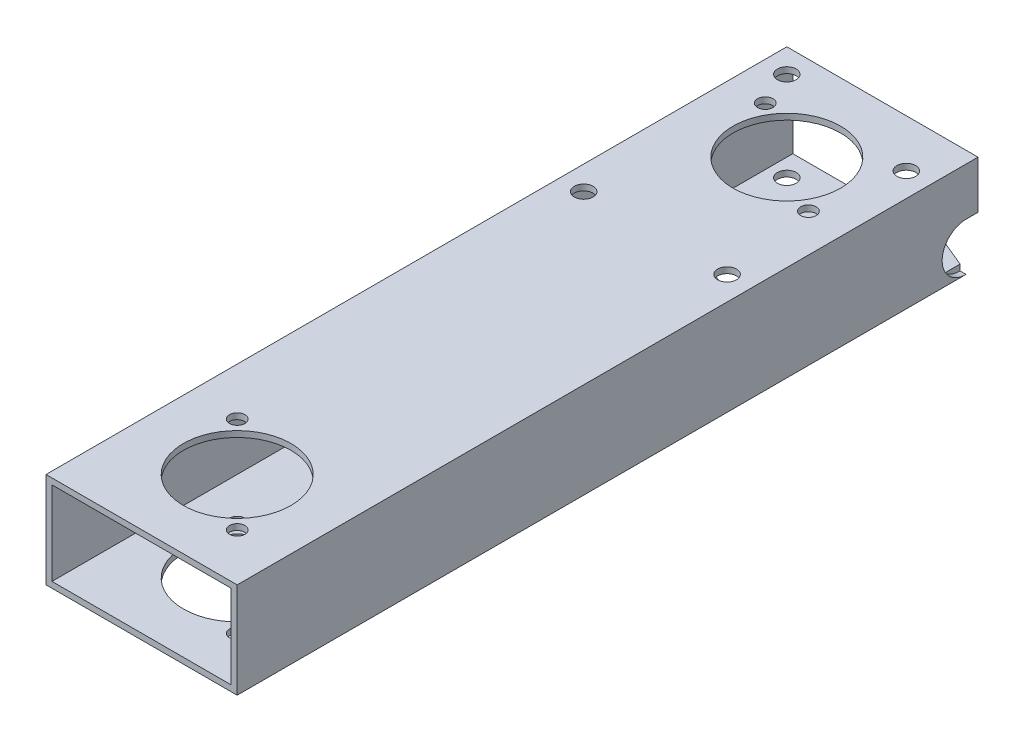
ISO-10303-21;
HEADER;
FILE_DESCRIPTION(('STEP AP214'),'2;1');
FILE_NAME('part.step','',(''),(''),'','','');
FILE_SCHEMA(('AUTOMOTIVE_DESIGN { 1 0 10303 214 1 1 1 1 }'));
ENDSEC;
DATA;
#1=APPLICATION_CONTEXT('core data for automotive mechanical design processes');
#2=APPLICATION_PROTOCOL_DEFINITION('international standard','automotive_design',2000,#1);
#3=PRODUCT_CONTEXT('',#1,'mechanical');
#4=PRODUCT('Part','Part','',(#3));
#5=PRODUCT_RELATED_PRODUCT_CATEGORY('part','',(#4));
#6=PRODUCT_DEFINITION_FORMATION('','',#4);
#7=PRODUCT_DEFINITION_CONTEXT('part definition',#1,'design');
#8=PRODUCT_DEFINITION('design','',#6,#7);
#9=PRODUCT_DEFINITION_SHAPE('','',#8);
#10=(LENGTH_UNIT() NAMED_UNIT(*) SI_UNIT(.MILLI.,.METRE.));
#11=(NAMED_UNIT(*) PLANE_ANGLE_UNIT() SI_UNIT($,.RADIAN.));
#12=(NAMED_UNIT(*) SI_UNIT($,.STERADIAN.) SOLID_ANGLE_UNIT());
#13=UNCERTAINTY_MEASURE_WITH_UNIT(LENGTH_MEASURE(1.E-05),#10,'distance_accuracy_value','');
#14=(GEOMETRIC_REPRESENTATION_CONTEXT(3) GLOBAL_UNCERTAINTY_ASSIGNED_CONTEXT((#13)) GLOBAL_UNIT_ASSIGNED_CONTEXT((#10,
#11,#12)) REPRESENTATION_CONTEXT('',''));
#15=CARTESIAN_POINT('',(0.,0.,0.));
#16=DIRECTION('',(0.,0.,1.));
#17=DIRECTION('',(1.,0.,0.));
#18=AXIS2_PLACEMENT_3D('',#15,#16,#17);
#19=CARTESIAN_POINT('',(25.4,12.7,98.4249994920001));
#20=DIRECTION('',(0.,-1.,0.));
#21=DIRECTION('',(1.,0.,0.));
#22=AXIS2_PLACEMENT_3D('',#19,#20,#21);
#23=PLANE('',#22);
#24=CARTESIAN_POINT('',(12.7519636919177,12.7,85.7769636919184));
#25=DIRECTION('',(0.,1.,0.));
#26=DIRECTION('',(0.,0.,1.));
#27=AXIS2_PLACEMENT_3D('',#24,#25,#26);
#28=CIRCLE('',#27,2.04469999999999);
#29=CARTESIAN_POINT('',(12.7519636919177,12.7,87.8216636919183));
#30=VERTEX_POINT('',#29);
#31=EDGE_CURVE('E449',#30,#30,#28,.T.);
#32=ORIENTED_EDGE('',*,*,#31,.F.);
#33=EDGE_LOOP('',(#32));
#34=FACE_BOUND('',#33,.T.);
#35=CARTESIAN_POINT('',(-15.2936993636111,12.7,-82.5815640151407));
#36=DIRECTION('',(0.,-1.,0.));
#37=DIRECTION('',(0.,0.,-1.));
#38=AXIS2_PLACEMENT_3D('',#35,#36,#37);
#39=CIRCLE('',#38,2.0447);
#40=CARTESIAN_POINT('',(-15.2936993636111,12.7,-84.6262640151407));
#41=VERTEX_POINT('',#40);
#42=EDGE_CURVE('E344',#41,#41,#39,.T.);
#43=ORIENTED_EDGE('',*,*,#42,.T.);
#44=EDGE_LOOP('',(#43));
#45=FACE_BOUND('',#44,.T.);
#46=CARTESIAN_POINT('',(15.293699363611,12.7,-63.4684359848592));
#47=DIRECTION('',(0.,-1.,0.));
#48=DIRECTION('',(0.,0.,-1.));
#49=AXIS2_PLACEMENT_3D('',#46,#47,#48);
#50=CIRCLE('',#49,2.0447);
#51=CARTESIAN_POINT('',(15.293699363611,12.7,-65.5131359848592));
#52=VERTEX_POINT('',#51);
#53=EDGE_CURVE('E232',#52,#52,#50,.T.);
#54=ORIENTED_EDGE('',*,*,#53,.T.);
#55=EDGE_LOOP('',(#54));
#56=FACE_BOUND('',#55,.T.);
#57=CARTESIAN_POINT('',(19.0500000000008,12.7,-85.7249994917966));
#58=DIRECTION('',(0.,-1.,0.));
#59=DIRECTION('',(0.,0.,-1.));
#60=AXIS2_PLACEMENT_3D('',#57,#58,#59);
#61=CIRCLE('',#60,2.48919999999999);
#62=CARTESIAN_POINT('',(19.0500000000008,12.7,-88.2141994917966));
#63=VERTEX_POINT('',#62);
#64=EDGE_CURVE('E228',#63,#63,#61,.T.);
#65=ORIENTED_EDGE('',*,*,#64,.T.);
#66=EDGE_LOOP('',(#65));
#67=FACE_BOUND('',#66,.T.);
#68=CARTESIAN_POINT('',(-19.0500000000001,12.7,-92.0749994917965));
#69=DIRECTION('',(0.,-1.,0.));
#70=DIRECTION('',(0.,0.,-1.));
#71=AXIS2_PLACEMENT_3D('',#68,#69,#70);
#72=CIRCLE('',#71,2.48919999999999);
#73=CARTESIAN_POINT('',(-19.0500000000001,12.7,-94.5641994917965));
#74=VERTEX_POINT('',#73);
#75=EDGE_CURVE('E224',#74,#74,#72,.T.);
#76=ORIENTED_EDGE('',*,*,#75,.T.);
#77=EDGE_LOOP('',(#76));
#78=FACE_BOUND('',#77,.T.);
#79=CARTESIAN_POINT('',(-19.0500000000001,12.7,-38.0999994917965));
#80=DIRECTION('',(0.,-1.,0.));
#81=DIRECTION('',(0.,0.,-1.));
#82=AXIS2_PLACEMENT_3D('',#79,#80,#81);
#83=CIRCLE('',#82,2.48919999999999);
#84=CARTESIAN_POINT('',(-19.0500000000001,12.7,-40.5891994917965));
#85=VERTEX_POINT('',#84);
#86=EDGE_CURVE('E219',#85,#85,#83,.T.);
#87=ORIENTED_EDGE('',*,*,#86,.T.);
#88=EDGE_LOOP('',(#87));
#89=FACE_BOUND('',#88,.T.);
#90=CARTESIAN_POINT('',(19.0500000000007,12.7,-38.0999994917965));
#91=DIRECTION('',(0.,-1.,0.));
#92=DIRECTION('',(0.,0.,-1.));
#93=AXIS2_PLACEMENT_3D('',#90,#91,#92);
#94=CIRCLE('',#93,2.48919999999999);
#95=CARTESIAN_POINT('',(19.0500000000007,12.7,-40.5891994917965));
#96=VERTEX_POINT('',#95);
#97=EDGE_CURVE('E271',#96,#96,#94,.T.);
#98=ORIENTED_EDGE('',*,*,#97,.T.);
#99=EDGE_LOOP('',(#98));
#100=FACE_BOUND('',#99,.T.);
#101=CARTESIAN_POINT('',(0.,12.7,-73.025));
#102=DIRECTION('',(0.,-1.,0.));
#103=DIRECTION('',(1.,0.,0.));
#104=AXIS2_PLACEMENT_3D('',#101,#102,#103);
#105=CIRCLE('',#104,14.2875);
#106=CARTESIAN_POINT('',(14.2875,12.7,-73.025));
#107=VERTEX_POINT('',#106);
#108=EDGE_CURVE('E211',#107,#107,#105,.T.);
#109=ORIENTED_EDGE('',*,*,#108,.T.);
#110=EDGE_LOOP('',(#109));
#111=FACE_BOUND('',#110,.T.);
#112=CARTESIAN_POINT('',(0.,12.7,73.025));
#113=DIRECTION('',(0.,-1.,0.));
#114=DIRECTION('',(1.,0.,0.));
#115=AXIS2_PLACEMENT_3D('',#112,#113,#114);
#116=CIRCLE('',#115,14.2875);
#117=CARTESIAN_POINT('',(14.2875,12.7,73.025));
#118=VERTEX_POINT('',#117);
#119=EDGE_CURVE('E301',#118,#118,#116,.T.);
#120=ORIENTED_EDGE('',*,*,#119,.T.);
#121=EDGE_LOOP('',(#120));
#122=FACE_BOUND('',#121,.T.);
#123=DIRECTION('',(0.,0.,-1.));
#124=VECTOR('',#123,1.);
#125=CARTESIAN_POINT('',(25.4,12.7,98.4249994920001));
#126=LINE('',#125,#124);
#127=CARTESIAN_POINT('',(25.4,12.7,98.4249994920001));
#128=VERTEX_POINT('',#127);
#129=CARTESIAN_POINT('',(25.4,12.7,-98.4249994920001));
#130=VERTEX_POINT('',#129);
#131=EDGE_CURVE('E202',#128,#130,#126,.T.);
#132=ORIENTED_EDGE('',*,*,#131,.T.);
#133=DIRECTION('',(-1.,0.,0.));
#134=VECTOR('',#133,1.);
#135=CARTESIAN_POINT('',(25.4,12.7,-98.4249994920001));
#136=LINE('',#135,#134);
#137=CARTESIAN_POINT('',(-25.4,12.7,-98.4249994920001));
#138=VERTEX_POINT('',#137);
#139=EDGE_CURVE('E173',#130,#138,#136,.T.);
#140=ORIENTED_EDGE('',*,*,#139,.T.);
#141=DIRECTION('',(0.,0.,-1.));
#142=VECTOR('',#141,1.);
#143=CARTESIAN_POINT('',(-25.4,12.7,98.4249994920001));
#144=LINE('',#143,#142);
#145=CARTESIAN_POINT('',(-25.4,12.7,98.4249994920001));
#146=VERTEX_POINT('',#145);
#147=EDGE_CURVE('E200',#146,#138,#144,.T.);
#148=ORIENTED_EDGE('',*,*,#147,.F.);
#149=DIRECTION('',(-1.,0.,0.));
#150=VECTOR('',#149,1.);
#151=CARTESIAN_POINT('',(25.4,12.7,98.4249994920001));
#152=LINE('',#151,#150);
#153=EDGE_CURVE('E198',#128,#146,#152,.T.);
#154=ORIENTED_EDGE('',*,*,#153,.F.);
#155=EDGE_LOOP('',(#132,#140,#148,#154));
#156=FACE_BOUND('',#155,.T.);
#157=CARTESIAN_POINT('',(-12.7519636919187,12.7,60.273036308082));
#158=DIRECTION('',(0.,1.,0.));
#159=DIRECTION('',(0.,0.,1.));
#160=AXIS2_PLACEMENT_3D('',#157,#158,#159);
#161=CIRCLE('',#160,2.04469999999999);
#162=CARTESIAN_POINT('',(-12.7519636919187,12.7,62.3177363080819));
#163=VERTEX_POINT('',#162);
#164=EDGE_CURVE('E436',#163,#163,#161,.T.);
#165=ORIENTED_EDGE('',*,*,#164,.F.);
#166=EDGE_LOOP('',(#165));
#167=FACE_BOUND('',#166,.T.);
#168=ADVANCED_FACE('F42',(#34,#45,#56,#67,#78,#89,#100,#111,#122,#156,#167),#23,.F.);
#169=CARTESIAN_POINT('',(-25.4,-12.7,98.4249994920001));
#170=DIRECTION('',(0.,1.,0.));
#171=DIRECTION('',(-1.,0.,0.));
#172=AXIS2_PLACEMENT_3D('',#169,#170,#171);
#173=PLANE('',#172);
#174=CARTESIAN_POINT('',(-12.7519636919187,-12.7,60.273036308082));
#175=DIRECTION('',(0.,1.,0.));
#176=DIRECTION('',(0.,0.,1.));
#177=AXIS2_PLACEMENT_3D('',#174,#175,#176);
#178=CIRCLE('',#177,2.0447);
#179=CARTESIAN_POINT('',(-12.7519636919187,-12.7,62.317736308082));
#180=VERTEX_POINT('',#179);
#181=EDGE_CURVE('E438',#180,#180,#178,.T.);
#182=ORIENTED_EDGE('',*,*,#181,.T.);
#183=EDGE_LOOP('',(#182));
#184=FACE_BOUND('',#183,.T.);
#185=CARTESIAN_POINT('',(12.7519636919177,-12.7,85.7769636919184));
#186=DIRECTION('',(0.,1.,0.));
#187=DIRECTION('',(0.,0.,1.));
#188=AXIS2_PLACEMENT_3D('',#185,#186,#187);
#189=CIRCLE('',#188,2.0447);
#190=CARTESIAN_POINT('',(12.7519636919177,-12.7,87.8216636919183));
#191=VERTEX_POINT('',#190);
#192=EDGE_CURVE('E451',#191,#191,#189,.T.);
#193=ORIENTED_EDGE('',*,*,#192,.T.);
#194=EDGE_LOOP('',(#193));
#195=FACE_BOUND('',#194,.T.);
#196=CARTESIAN_POINT('',(15.293699363611,-12.7,-63.4684359848592));
#197=DIRECTION('',(0.,-1.,0.));
#198=DIRECTION('',(0.,0.,-1.));
#199=AXIS2_PLACEMENT_3D('',#196,#197,#198);
#200=CIRCLE('',#199,2.04469999999999);
#201=CARTESIAN_POINT('',(15.293699363611,-12.7,-65.5131359848592));
#202=VERTEX_POINT('',#201);
#203=EDGE_CURVE('E239',#202,#202,#200,.T.);
#204=ORIENTED_EDGE('',*,*,#203,.F.);
#205=EDGE_LOOP('',(#204));
#206=FACE_BOUND('',#205,.T.);
#207=CARTESIAN_POINT('',(19.0500000000008,-12.7,-85.7249994917966));
#208=DIRECTION('',(0.,-1.,0.));
#209=DIRECTION('',(0.,0.,-1.));
#210=AXIS2_PLACEMENT_3D('',#207,#208,#209);
#211=CIRCLE('',#210,2.48919999999999);
#212=CARTESIAN_POINT('',(19.0500000000008,-12.7,-88.2141994917966));
#213=VERTEX_POINT('',#212);
#214=EDGE_CURVE('E236',#213,#213,#211,.T.);
#215=ORIENTED_EDGE('',*,*,#214,.F.);
#216=EDGE_LOOP('',(#215));
#217=FACE_BOUND('',#216,.T.);
#218=CARTESIAN_POINT('',(-19.0500000000001,-12.7,-92.0749994917965));
#219=DIRECTION('',(0.,-1.,0.));
#220=DIRECTION('',(0.,0.,-1.));
#221=AXIS2_PLACEMENT_3D('',#218,#219,#220);
#222=CIRCLE('',#221,2.48919999999999);
#223=CARTESIAN_POINT('',(-19.0500000000001,-12.7,-94.5641994917965));
#224=VERTEX_POINT('',#223);
#225=EDGE_CURVE('E254',#224,#224,#222,.T.);
#226=ORIENTED_EDGE('',*,*,#225,.F.);
#227=EDGE_LOOP('',(#226));
#228=FACE_BOUND('',#227,.T.);
#229=CARTESIAN_POINT('',(-19.0500000000001,-12.7,-38.0999994917965));
#230=DIRECTION('',(0.,-1.,0.));
#231=DIRECTION('',(0.,0.,-1.));
#232=AXIS2_PLACEMENT_3D('',#229,#230,#231);
#233=CIRCLE('',#232,2.48919999999999);
#234=CARTESIAN_POINT('',(-19.0500000000001,-12.7,-40.5891994917965));
#235=VERTEX_POINT('',#234);
#236=EDGE_CURVE('E261',#235,#235,#233,.T.);
#237=ORIENTED_EDGE('',*,*,#236,.F.);
#238=EDGE_LOOP('',(#237));
#239=FACE_BOUND('',#238,.T.);
#240=CARTESIAN_POINT('',(19.0500000000007,-12.7,-38.0999994917965));
#241=DIRECTION('',(0.,-1.,0.));
#242=DIRECTION('',(0.,0.,-1.));
#243=AXIS2_PLACEMENT_3D('',#240,#241,#242);
#244=CIRCLE('',#243,2.48919999999999);
#245=CARTESIAN_POINT('',(19.0500000000007,-12.7,-40.5891994917965));
#246=VERTEX_POINT('',#245);
#247=EDGE_CURVE('E268',#246,#246,#244,.T.);
#248=ORIENTED_EDGE('',*,*,#247,.F.);
#249=EDGE_LOOP('',(#248));
#250=FACE_BOUND('',#249,.T.);
#251=CARTESIAN_POINT('',(0.,-12.7,-73.025));
#252=DIRECTION('',(0.,-1.,0.));
#253=DIRECTION('',(1.,0.,0.));
#254=AXIS2_PLACEMENT_3D('',#251,#252,#253);
#255=CIRCLE('',#254,14.2875);
#256=CARTESIAN_POINT('',(14.2875,-12.7,-73.025));
#257=VERTEX_POINT('',#256);
#258=EDGE_CURVE('E304',#257,#257,#255,.T.);
#259=ORIENTED_EDGE('',*,*,#258,.F.);
#260=EDGE_LOOP('',(#259));
#261=FACE_BOUND('',#260,.T.);
#262=CARTESIAN_POINT('',(0.,-12.7,73.025));
#263=DIRECTION('',(0.,-1.,0.));
#264=DIRECTION('',(1.,0.,0.));
#265=AXIS2_PLACEMENT_3D('',#262,#263,#264);
#266=CIRCLE('',#265,14.2875);
#267=CARTESIAN_POINT('',(14.2875,-12.7,73.025));
#268=VERTEX_POINT('',#267);
#269=EDGE_CURVE('E307',#268,#268,#266,.T.);
#270=ORIENTED_EDGE('',*,*,#269,.F.);
#271=EDGE_LOOP('',(#270));
#272=FACE_BOUND('',#271,.T.);
#273=DIRECTION('',(1.,0.,0.));
#274=VECTOR('',#273,1.);
#275=CARTESIAN_POINT('',(-25.4,-12.7,-98.4249994920001));
#276=LINE('',#275,#274);
#277=CARTESIAN_POINT('',(-25.4,-12.7,-98.4249994920001));
#278=VERTEX_POINT('',#277);
#279=CARTESIAN_POINT('',(16.1925,-12.7,-98.4249994920001));
#280=VERTEX_POINT('',#279);
#281=EDGE_CURVE('E169',#278,#280,#276,.T.);
#282=ORIENTED_EDGE('',*,*,#281,.T.);
#283=DIRECTION('',(-0.923076923076923,0.,-0.384615384615384));
#284=VECTOR('',#283,1.);
#285=CARTESIAN_POINT('',(23.8125,-12.7,-95.2499994920001));
#286=LINE('',#285,#284);
#287=CARTESIAN_POINT('',(23.8125,-12.7,-95.2499994920001));
#288=VERTEX_POINT('',#287);
#289=EDGE_CURVE('E134',#288,#280,#286,.T.);
#290=ORIENTED_EDGE('',*,*,#289,.F.);
#291=DIRECTION('',(1.,0.,0.));
#292=VECTOR('',#291,1.);
#293=CARTESIAN_POINT('',(23.8125,-12.7,-95.2499994920001));
#294=LINE('',#293,#292);
#295=CARTESIAN_POINT('',(25.4,-12.7,-95.2499994920001));
#296=VERTEX_POINT('',#295);
#297=EDGE_CURVE('E289',#288,#296,#294,.T.);
#298=ORIENTED_EDGE('',*,*,#297,.T.);
#299=DIRECTION('',(0.,0.,-1.));
#300=VECTOR('',#299,1.);
#301=CARTESIAN_POINT('',(25.4,-12.7,98.4249994920001));
#302=LINE('',#301,#300);
#303=CARTESIAN_POINT('',(25.4,-12.7,98.4249994920001));
#304=VERTEX_POINT('',#303);
#305=EDGE_CURVE('E51',#304,#296,#302,.T.);
#306=ORIENTED_EDGE('',*,*,#305,.F.);
#307=DIRECTION('',(1.,0.,0.));
#308=VECTOR('',#307,1.);
#309=CARTESIAN_POINT('',(-25.4,-12.7,98.4249994920001));
#310=LINE('',#309,#308);
#311=CARTESIAN_POINT('',(-25.4,-12.7,98.4249994920001));
#312=VERTEX_POINT('',#311);
#313=EDGE_CURVE('E194',#312,#304,#310,.T.);
#314=ORIENTED_EDGE('',*,*,#313,.F.);
#315=DIRECTION('',(0.,0.,-1.));
#316=VECTOR('',#315,1.);
#317=CARTESIAN_POINT('',(-25.4,-12.7,98.4249994920001));
#318=LINE('',#317,#316);
#319=EDGE_CURVE('E11',#312,#278,#318,.T.);
#320=ORIENTED_EDGE('',*,*,#319,.T.);
#321=EDGE_LOOP('',(#282,#290,#298,#306,#314,#320));
#322=FACE_BOUND('',#321,.T.);
#323=CARTESIAN_POINT('',(-15.2936993636111,-12.7,-82.5815640151407));
#324=DIRECTION('',(0.,-1.,0.));
#325=DIRECTION('',(0.,0.,-1.));
#326=AXIS2_PLACEMENT_3D('',#323,#324,#325);
#327=CIRCLE('',#326,2.04469999999999);
#328=CARTESIAN_POINT('',(-15.2936993636111,-12.7,-84.6262640151406));
#329=VERTEX_POINT('',#328);
#330=EDGE_CURVE('E342',#329,#329,#327,.T.);
#331=ORIENTED_EDGE('',*,*,#330,.F.);
#332=EDGE_LOOP('',(#331));
#333=FACE_BOUND('',#332,.T.);
#334=ADVANCED_FACE('F334',(#184,#195,#206,#217,#228,#239,#250,#261,#272,#322,#333),#173,.F.);
#335=CARTESIAN_POINT('',(0.,0.,98.4249994920001));
#336=DIRECTION('',(0.,0.,1.));
#337=DIRECTION('',(1.,0.,0.));
#338=AXIS2_PLACEMENT_3D('',#335,#336,#337);
#339=PLANE('',#338);
#340=DIRECTION('',(0.,-1.,0.));
#341=VECTOR('',#340,1.);
#342=CARTESIAN_POINT('',(-25.4,12.7,98.4249994920001));
#343=LINE('',#342,#341);
#344=EDGE_CURVE('E191',#146,#312,#343,.T.);
#345=ORIENTED_EDGE('',*,*,#344,.T.);
#346=ORIENTED_EDGE('',*,*,#313,.T.);
#347=DIRECTION('',(0.,1.,0.));
#348=VECTOR('',#347,1.);
#349=CARTESIAN_POINT('',(25.4,-12.7,98.4249994920001));
#350=LINE('',#349,#348);
#351=EDGE_CURVE('E196',#304,#128,#350,.T.);
#352=ORIENTED_EDGE('',*,*,#351,.T.);
#353=ORIENTED_EDGE('',*,*,#153,.T.);
#354=EDGE_LOOP('',(#345,#346,#352,#353));
#355=FACE_BOUND('',#354,.T.);
#356=DIRECTION('',(1.,0.,0.));
#357=VECTOR('',#356,1.);
#358=CARTESIAN_POINT('',(-23.8125,-11.1125,98.4249994920001));
#359=LINE('',#358,#357);
#360=CARTESIAN_POINT('',(-23.8125,-11.1125,98.4249994920001));
#361=VERTEX_POINT('',#360);
#362=CARTESIAN_POINT('',(23.8125,-11.1125,98.4249994920001));
#363=VERTEX_POINT('',#362);
#364=EDGE_CURVE('E178',#361,#363,#359,.T.);
#365=ORIENTED_EDGE('',*,*,#364,.F.);
#366=DIRECTION('',(0.,-1.,0.));
#367=VECTOR('',#366,1.);
#368=CARTESIAN_POINT('',(-23.8125,11.1125,98.4249994920001));
#369=LINE('',#368,#367);
#370=CARTESIAN_POINT('',(-23.8125,11.1125,98.4249994920001));
#371=VERTEX_POINT('',#370);
#372=EDGE_CURVE('E176',#371,#361,#369,.T.);
#373=ORIENTED_EDGE('',*,*,#372,.F.);
#374=DIRECTION('',(-1.,0.,0.));
#375=VECTOR('',#374,1.);
#376=CARTESIAN_POINT('',(23.8125,11.1125,98.4249994920001));
#377=LINE('',#376,#375);
#378=CARTESIAN_POINT('',(23.8125,11.1125,98.4249994920001));
#379=VERTEX_POINT('',#378);
#380=EDGE_CURVE('E182',#379,#371,#377,.T.);
#381=ORIENTED_EDGE('',*,*,#380,.F.);
#382=DIRECTION('',(0.,1.,0.));
#383=VECTOR('',#382,1.);
#384=CARTESIAN_POINT('',(23.8125,-11.1125,98.4249994920001));
#385=LINE('',#384,#383);
#386=EDGE_CURVE('E180',#363,#379,#385,.T.);
#387=ORIENTED_EDGE('',*,*,#386,.F.);
#388=EDGE_LOOP('',(#365,#373,#381,#387));
#389=FACE_BOUND('',#388,.T.);
#390=ADVANCED_FACE('F337',(#355,#389),#339,.T.);
#391=CARTESIAN_POINT('',(-25.4,12.7,98.4249994920001));
#392=DIRECTION('',(1.,0.,0.));
#393=DIRECTION('',(0.,0.,-1.));
#394=AXIS2_PLACEMENT_3D('',#391,#392,#393);
#395=PLANE('',#394);
#396=ORIENTED_EDGE('',*,*,#147,.T.);
#397=DIRECTION('',(0.,-1.,0.));
#398=VECTOR('',#397,1.);
#399=CARTESIAN_POINT('',(-25.4,12.7,-98.4249994920001));
#400=LINE('',#399,#398);
#401=EDGE_CURVE('E166',#138,#278,#400,.T.);
#402=ORIENTED_EDGE('',*,*,#401,.T.);
#403=ORIENTED_EDGE('',*,*,#319,.F.);
#404=ORIENTED_EDGE('',*,*,#344,.F.);
#405=EDGE_LOOP('',(#396,#402,#403,#404));
#406=FACE_BOUND('',#405,.T.);
#407=ADVANCED_FACE('F44',(#406),#395,.F.);
#408=CARTESIAN_POINT('',(25.4,-12.7,98.4249994920001));
#409=DIRECTION('',(-1.,0.,0.));
#410=DIRECTION('',(0.,0.,1.));
#411=AXIS2_PLACEMENT_3D('',#408,#409,#410);
#412=PLANE('',#411);
#413=ORIENTED_EDGE('',*,*,#305,.T.);
#414=CARTESIAN_POINT('',(25.4,-6.35,-95.2499994920001));
#415=DIRECTION('',(1.,0.,0.));
#416=DIRECTION('',(0.,0.,-1.));
#417=AXIS2_PLACEMENT_3D('',#414,#415,#416);
#418=CIRCLE('',#417,6.35);
#419=CARTESIAN_POINT('',(25.4,0.,-95.2499994920001));
#420=VERTEX_POINT('',#419);
#421=EDGE_CURVE('E139',#420,#296,#418,.T.);
#422=ORIENTED_EDGE('',*,*,#421,.F.);
#423=DIRECTION('',(0.,0.,1.));
#424=VECTOR('',#423,1.);
#425=CARTESIAN_POINT('',(25.4,0.,-95.2499994920001));
#426=LINE('',#425,#424);
#427=CARTESIAN_POINT('',(25.4,0.,-98.4249994920001));
#428=VERTEX_POINT('',#427);
#429=EDGE_CURVE('E291',#428,#420,#426,.T.);
#430=ORIENTED_EDGE('',*,*,#429,.F.);
#431=DIRECTION('',(0.,1.,0.));
#432=VECTOR('',#431,1.);
#433=CARTESIAN_POINT('',(25.4,-12.7,-98.4249994920001));
#434=LINE('',#433,#432);
#435=EDGE_CURVE('E171',#428,#130,#434,.T.);
#436=ORIENTED_EDGE('',*,*,#435,.T.);
#437=ORIENTED_EDGE('',*,*,#131,.F.);
#438=ORIENTED_EDGE('',*,*,#351,.F.);
#439=EDGE_LOOP('',(#413,#422,#430,#436,#437,#438));
#440=FACE_BOUND('',#439,.T.);
#441=ADVANCED_FACE('F396',(#440),#412,.F.);
#442=CARTESIAN_POINT('',(-23.8125,11.1125,98.4249994920001));
#443=DIRECTION('',(1.,0.,0.));
#444=DIRECTION('',(0.,1.,0.));
#445=AXIS2_PLACEMENT_3D('',#442,#443,#444);
#446=PLANE('',#445);
#447=DIRECTION('',(0.,0.,-1.));
#448=VECTOR('',#447,1.);
#449=CARTESIAN_POINT('',(-23.8125,-11.1125,98.4249994920001));
#450=LINE('',#449,#448);
#451=CARTESIAN_POINT('',(-23.8125,-11.1125,-98.4249994920001));
#452=VERTEX_POINT('',#451);
#453=EDGE_CURVE('E189',#361,#452,#450,.T.);
#454=ORIENTED_EDGE('',*,*,#453,.T.);
#455=DIRECTION('',(0.,-1.,0.));
#456=VECTOR('',#455,1.);
#457=CARTESIAN_POINT('',(-23.8125,11.1125,-98.4249994920001));
#458=LINE('',#457,#456);
#459=CARTESIAN_POINT('',(-23.8125,11.1125,-98.4249994920001));
#460=VERTEX_POINT('',#459);
#461=EDGE_CURVE('E156',#460,#452,#458,.T.);
#462=ORIENTED_EDGE('',*,*,#461,.F.);
#463=DIRECTION('',(0.,0.,-1.));
#464=VECTOR('',#463,1.);
#465=CARTESIAN_POINT('',(-23.8125,11.1125,98.4249994920001));
#466=LINE('',#465,#464);
#467=EDGE_CURVE('E184',#371,#460,#466,.T.);
#468=ORIENTED_EDGE('',*,*,#467,.F.);
#469=ORIENTED_EDGE('',*,*,#372,.T.);
#470=EDGE_LOOP('',(#454,#462,#468,#469));
#471=FACE_BOUND('',#470,.T.);
#472=ADVANCED_FACE('F321',(#471),#446,.T.);
#473=CARTESIAN_POINT('',(-23.8125,-11.1125,98.4249994920001));
#474=DIRECTION('',(0.,1.,0.));
#475=DIRECTION('',(0.,0.,1.));
#476=AXIS2_PLACEMENT_3D('',#473,#474,#475);
#477=PLANE('',#476);
#478=CARTESIAN_POINT('',(-12.7519636919187,-11.1125,60.273036308082));
#479=DIRECTION('',(0.,1.,0.));
#480=DIRECTION('',(0.,0.,1.));
#481=AXIS2_PLACEMENT_3D('',#478,#479,#480);
#482=CIRCLE('',#481,2.04469999999999);
#483=CARTESIAN_POINT('',(-12.7519636919187,-11.1125,62.3177363080819));
#484=VERTEX_POINT('',#483);
#485=EDGE_CURVE('E446',#484,#484,#482,.T.);
#486=ORIENTED_EDGE('',*,*,#485,.F.);
#487=EDGE_LOOP('',(#486));
#488=FACE_BOUND('',#487,.T.);
#489=CARTESIAN_POINT('',(12.7519636919177,-11.1125,85.7769636919184));
#490=DIRECTION('',(0.,1.,0.));
#491=DIRECTION('',(0.,0.,1.));
#492=AXIS2_PLACEMENT_3D('',#489,#490,#491);
#493=CIRCLE('',#492,2.04469999999999);
#494=CARTESIAN_POINT('',(12.7519636919177,-11.1125,87.8216636919183));
#495=VERTEX_POINT('',#494);
#496=EDGE_CURVE('E46',#495,#495,#493,.T.);
#497=ORIENTED_EDGE('',*,*,#496,.F.);
#498=EDGE_LOOP('',(#497));
#499=FACE_BOUND('',#498,.T.);
#500=CARTESIAN_POINT('',(-15.2936993636111,-11.1125,-82.5815640151407));
#501=DIRECTION('',(0.,1.,0.));
#502=DIRECTION('',(0.,0.,1.));
#503=AXIS2_PLACEMENT_3D('',#500,#501,#502);
#504=CIRCLE('',#503,2.04469999999999);
#505=CARTESIAN_POINT('',(-15.2936993636111,-11.1125,-80.5368640151407));
#506=VERTEX_POINT('',#505);
#507=EDGE_CURVE('E348',#506,#506,#504,.T.);
#508=ORIENTED_EDGE('',*,*,#507,.F.);
#509=EDGE_LOOP('',(#508));
#510=FACE_BOUND('',#509,.T.);
#511=CARTESIAN_POINT('',(15.293699363611,-11.1125,-63.4684359848592));
#512=DIRECTION('',(0.,1.,0.));
#513=DIRECTION('',(0.,0.,1.));
#514=AXIS2_PLACEMENT_3D('',#511,#512,#513);
#515=CIRCLE('',#514,2.04469999999999);
#516=CARTESIAN_POINT('',(15.293699363611,-11.1125,-61.4237359848592));
#517=VERTEX_POINT('',#516);
#518=EDGE_CURVE('E231',#517,#517,#515,.T.);
#519=ORIENTED_EDGE('',*,*,#518,.F.);
#520=EDGE_LOOP('',(#519));
#521=FACE_BOUND('',#520,.T.);
#522=CARTESIAN_POINT('',(19.0500000000008,-11.1125,-85.7249994917966));
#523=DIRECTION('',(0.,1.,0.));
#524=DIRECTION('',(0.,0.,1.));
#525=AXIS2_PLACEMENT_3D('',#522,#523,#524);
#526=CIRCLE('',#525,2.48919999999999);
#527=CARTESIAN_POINT('',(19.0500000000008,-11.1125,-83.2357994917966));
#528=VERTEX_POINT('',#527);
#529=EDGE_CURVE('E227',#528,#528,#526,.T.);
#530=ORIENTED_EDGE('',*,*,#529,.F.);
#531=EDGE_LOOP('',(#530));
#532=FACE_BOUND('',#531,.T.);
#533=CARTESIAN_POINT('',(-19.0500000000001,-11.1125,-92.0749994917965));
#534=DIRECTION('',(0.,1.,0.));
#535=DIRECTION('',(0.,0.,1.));
#536=AXIS2_PLACEMENT_3D('',#533,#534,#535);
#537=CIRCLE('',#536,2.48919999999999);
#538=CARTESIAN_POINT('',(-19.0500000000001,-11.1125,-89.5857994917965));
#539=VERTEX_POINT('',#538);
#540=EDGE_CURVE('E223',#539,#539,#537,.T.);
#541=ORIENTED_EDGE('',*,*,#540,.F.);
#542=EDGE_LOOP('',(#541));
#543=FACE_BOUND('',#542,.T.);
#544=CARTESIAN_POINT('',(-19.0500000000001,-11.1125,-38.0999994917965));
#545=DIRECTION('',(0.,1.,0.));
#546=DIRECTION('',(0.,0.,1.));
#547=AXIS2_PLACEMENT_3D('',#544,#545,#546);
#548=CIRCLE('',#547,2.48919999999999);
#549=CARTESIAN_POINT('',(-19.0500000000001,-11.1125,-35.6107994917966));
#550=VERTEX_POINT('',#549);
#551=EDGE_CURVE('E215',#550,#550,#548,.T.);
#552=ORIENTED_EDGE('',*,*,#551,.F.);
#553=EDGE_LOOP('',(#552));
#554=FACE_BOUND('',#553,.T.);
#555=CARTESIAN_POINT('',(19.0500000000007,-11.1125,-38.0999994917965));
#556=DIRECTION('',(0.,1.,0.));
#557=DIRECTION('',(0.,0.,1.));
#558=AXIS2_PLACEMENT_3D('',#555,#556,#557);
#559=CIRCLE('',#558,2.48919999999999);
#560=CARTESIAN_POINT('',(19.0500000000007,-11.1125,-35.6107994917965));
#561=VERTEX_POINT('',#560);
#562=EDGE_CURVE('E277',#561,#561,#559,.T.);
#563=ORIENTED_EDGE('',*,*,#562,.F.);
#564=EDGE_LOOP('',(#563));
#565=FACE_BOUND('',#564,.T.);
#566=DIRECTION('',(-0.923076923076923,0.,-0.384615384615384));
#567=VECTOR('',#566,1.);
#568=CARTESIAN_POINT('',(23.8125,-11.1125,-95.2499994920001));
#569=LINE('',#568,#567);
#570=CARTESIAN_POINT('',(23.8125,-11.1125,-95.2499994920001));
#571=VERTEX_POINT('',#570);
#572=CARTESIAN_POINT('',(16.1925,-11.1125,-98.4249994920001));
#573=VERTEX_POINT('',#572);
#574=EDGE_CURVE('E59',#571,#573,#569,.T.);
#575=ORIENTED_EDGE('',*,*,#574,.T.);
#576=DIRECTION('',(1.,0.,0.));
#577=VECTOR('',#576,1.);
#578=CARTESIAN_POINT('',(-23.8125,-11.1125,-98.4249994920001));
#579=LINE('',#578,#577);
#580=EDGE_CURVE('E148',#452,#573,#579,.T.);
#581=ORIENTED_EDGE('',*,*,#580,.F.);
#582=ORIENTED_EDGE('',*,*,#453,.F.);
#583=ORIENTED_EDGE('',*,*,#364,.T.);
#584=DIRECTION('',(0.,0.,-1.));
#585=VECTOR('',#584,1.);
#586=CARTESIAN_POINT('',(23.8125,-11.1125,98.4249994920001));
#587=LINE('',#586,#585);
#588=CARTESIAN_POINT('',(23.8125,-11.1125,-91.0498692856851));
#589=VERTEX_POINT('',#588);
#590=EDGE_CURVE('E187',#363,#589,#587,.T.);
#591=ORIENTED_EDGE('',*,*,#590,.T.);
#592=DIRECTION('',(0.,0.,-1.));
#593=VECTOR('',#592,1.);
#594=CARTESIAN_POINT('',(23.8125,-11.1125,98.4249994920001));
#595=LINE('',#594,#593);
#596=EDGE_CURVE('E151',#589,#571,#595,.T.);
#597=ORIENTED_EDGE('',*,*,#596,.T.);
#598=EDGE_LOOP('',(#575,#581,#582,#583,#591,#597));
#599=FACE_BOUND('',#598,.T.);
#600=CARTESIAN_POINT('',(0.,-11.1125,-73.025));
#601=DIRECTION('',(0.,1.,0.));
#602=DIRECTION('',(0.,0.,1.));
#603=AXIS2_PLACEMENT_3D('',#600,#601,#602);
#604=CIRCLE('',#603,14.2875);
#605=CARTESIAN_POINT('',(0.,-11.1125,-58.7375));
#606=VERTEX_POINT('',#605);
#607=EDGE_CURVE('E161',#606,#606,#604,.T.);
#608=ORIENTED_EDGE('',*,*,#607,.F.);
#609=EDGE_LOOP('',(#608));
#610=FACE_BOUND('',#609,.T.);
#611=CARTESIAN_POINT('',(0.,-11.1125,73.025));
#612=DIRECTION('',(0.,1.,0.));
#613=DIRECTION('',(0.,0.,1.));
#614=AXIS2_PLACEMENT_3D('',#611,#612,#613);
#615=CIRCLE('',#614,14.2875);
#616=CARTESIAN_POINT('',(0.,-11.1125,87.3125));
#617=VERTEX_POINT('',#616);
#618=EDGE_CURVE('E210',#617,#617,#615,.T.);
#619=ORIENTED_EDGE('',*,*,#618,.F.);
#620=EDGE_LOOP('',(#619));
#621=FACE_BOUND('',#620,.T.);
#622=ADVANCED_FACE('F145',(#488,#499,#510,#521,#532,#543,#554,#565,#599,#610,#621),#477,.T.);
#623=CARTESIAN_POINT('',(23.8125,-11.1125,98.4249994920001));
#624=DIRECTION('',(-1.,0.,0.));
#625=DIRECTION('',(0.,0.,1.));
#626=AXIS2_PLACEMENT_3D('',#623,#624,#625);
#627=PLANE('',#626);
#628=CARTESIAN_POINT('',(23.8125,-6.35,-95.2499994920001));
#629=DIRECTION('',(1.,0.,0.));
#630=DIRECTION('',(0.,0.,-1.));
#631=AXIS2_PLACEMENT_3D('',#628,#629,#630);
#632=CIRCLE('',#631,6.35);
#633=CARTESIAN_POINT('',(23.8125,0.,-95.2499994920001));
#634=VERTEX_POINT('',#633);
#635=EDGE_CURVE('E282',#634,#589,#632,.T.);
#636=ORIENTED_EDGE('',*,*,#635,.T.);
#637=ORIENTED_EDGE('',*,*,#590,.F.);
#638=ORIENTED_EDGE('',*,*,#386,.T.);
#639=DIRECTION('',(0.,0.,-1.));
#640=VECTOR('',#639,1.);
#641=CARTESIAN_POINT('',(23.8125,11.1125,98.4249994920001));
#642=LINE('',#641,#640);
#643=CARTESIAN_POINT('',(23.8125,11.1125,-98.4249994920001));
#644=VERTEX_POINT('',#643);
#645=EDGE_CURVE('E67',#379,#644,#642,.T.);
#646=ORIENTED_EDGE('',*,*,#645,.T.);
#647=DIRECTION('',(0.,1.,0.));
#648=VECTOR('',#647,1.);
#649=CARTESIAN_POINT('',(23.8125,-11.1125,-98.4249994920001));
#650=LINE('',#649,#648);
#651=CARTESIAN_POINT('',(23.8125,0.,-98.4249994920001));
#652=VERTEX_POINT('',#651);
#653=EDGE_CURVE('E157',#652,#644,#650,.T.);
#654=ORIENTED_EDGE('',*,*,#653,.F.);
#655=DIRECTION('',(0.,0.,1.));
#656=VECTOR('',#655,1.);
#657=CARTESIAN_POINT('',(23.8125,0.,-95.2499994920001));
#658=LINE('',#657,#656);
#659=EDGE_CURVE('E285',#652,#634,#658,.T.);
#660=ORIENTED_EDGE('',*,*,#659,.T.);
#661=EDGE_LOOP('',(#636,#637,#638,#646,#654,#660));
#662=FACE_BOUND('',#661,.T.);
#663=ADVANCED_FACE('F320',(#662),#627,.T.);
#664=CARTESIAN_POINT('',(23.8125,11.1125,98.4249994920001));
#665=DIRECTION('',(0.,-1.,0.));
#666=DIRECTION('',(0.,0.,-1.));
#667=AXIS2_PLACEMENT_3D('',#664,#665,#666);
#668=PLANE('',#667);
#669=CARTESIAN_POINT('',(-12.7519636919187,11.1125,60.273036308082));
#670=DIRECTION('',(0.,-1.,0.));
#671=DIRECTION('',(0.,0.,-1.));
#672=AXIS2_PLACEMENT_3D('',#669,#670,#671);
#673=CIRCLE('',#672,2.04469999999999);
#674=CARTESIAN_POINT('',(-12.7519636919187,11.1125,58.228336308082));
#675=VERTEX_POINT('',#674);
#676=EDGE_CURVE('E441',#675,#675,#673,.T.);
#677=ORIENTED_EDGE('',*,*,#676,.F.);
#678=EDGE_LOOP('',(#677));
#679=FACE_BOUND('',#678,.T.);
#680=CARTESIAN_POINT('',(12.7519636919177,11.1125,85.7769636919184));
#681=DIRECTION('',(0.,-1.,0.));
#682=DIRECTION('',(0.,0.,-1.));
#683=AXIS2_PLACEMENT_3D('',#680,#681,#682);
#684=CIRCLE('',#683,2.04469999999999);
#685=CARTESIAN_POINT('',(12.7519636919177,11.1125,83.7322636919184));
#686=VERTEX_POINT('',#685);
#687=EDGE_CURVE('E345',#686,#686,#684,.T.);
#688=ORIENTED_EDGE('',*,*,#687,.F.);
#689=EDGE_LOOP('',(#688));
#690=FACE_BOUND('',#689,.T.);
#691=CARTESIAN_POINT('',(-15.2936993636111,11.1125,-82.5815640151407));
#692=DIRECTION('',(0.,-1.,0.));
#693=DIRECTION('',(0.,0.,-1.));
#694=AXIS2_PLACEMENT_3D('',#691,#692,#693);
#695=CIRCLE('',#694,2.04469999999999);
#696=CARTESIAN_POINT('',(-15.2936993636111,11.1125,-84.6262640151407));
#697=VERTEX_POINT('',#696);
#698=EDGE_CURVE('E244',#697,#697,#695,.T.);
#699=ORIENTED_EDGE('',*,*,#698,.F.);
#700=EDGE_LOOP('',(#699));
#701=FACE_BOUND('',#700,.T.);
#702=CARTESIAN_POINT('',(15.293699363611,11.1125,-63.4684359848592));
#703=DIRECTION('',(0.,-1.,0.));
#704=DIRECTION('',(0.,0.,-1.));
#705=AXIS2_PLACEMENT_3D('',#702,#703,#704);
#706=CIRCLE('',#705,2.04469999999999);
#707=CARTESIAN_POINT('',(15.293699363611,11.1125,-65.5131359848592));
#708=VERTEX_POINT('',#707);
#709=EDGE_CURVE('E229',#708,#708,#706,.T.);
#710=ORIENTED_EDGE('',*,*,#709,.F.);
#711=EDGE_LOOP('',(#710));
#712=FACE_BOUND('',#711,.T.);
#713=CARTESIAN_POINT('',(19.0500000000008,11.1125,-85.7249994917966));
#714=DIRECTION('',(0.,-1.,0.));
#715=DIRECTION('',(0.,0.,-1.));
#716=AXIS2_PLACEMENT_3D('',#713,#714,#715);
#717=CIRCLE('',#716,2.48919999999999);
#718=CARTESIAN_POINT('',(19.0500000000008,11.1125,-88.2141994917966));
#719=VERTEX_POINT('',#718);
#720=EDGE_CURVE('E225',#719,#719,#717,.T.);
#721=ORIENTED_EDGE('',*,*,#720,.F.);
#722=EDGE_LOOP('',(#721));
#723=FACE_BOUND('',#722,.T.);
#724=CARTESIAN_POINT('',(-19.0500000000001,11.1125,-92.0749994917965));
#725=DIRECTION('',(0.,-1.,0.));
#726=DIRECTION('',(0.,0.,-1.));
#727=AXIS2_PLACEMENT_3D('',#724,#725,#726);
#728=CIRCLE('',#727,2.48919999999999);
#729=CARTESIAN_POINT('',(-19.0500000000001,11.1125,-94.5641994917965));
#730=VERTEX_POINT('',#729);
#731=EDGE_CURVE('E220',#730,#730,#728,.T.);
#732=ORIENTED_EDGE('',*,*,#731,.F.);
#733=EDGE_LOOP('',(#732));
#734=FACE_BOUND('',#733,.T.);
#735=CARTESIAN_POINT('',(-19.0500000000001,11.1125,-38.0999994917965));
#736=DIRECTION('',(0.,-1.,0.));
#737=DIRECTION('',(0.,0.,-1.));
#738=AXIS2_PLACEMENT_3D('',#735,#736,#737);
#739=CIRCLE('',#738,2.48919999999999);
#740=CARTESIAN_POINT('',(-19.0500000000001,11.1125,-40.5891994917965));
#741=VERTEX_POINT('',#740);
#742=EDGE_CURVE('E218',#741,#741,#739,.T.);
#743=ORIENTED_EDGE('',*,*,#742,.F.);
#744=EDGE_LOOP('',(#743));
#745=FACE_BOUND('',#744,.T.);
#746=CARTESIAN_POINT('',(19.0500000000007,11.1125,-38.0999994917965));
#747=DIRECTION('',(0.,-1.,0.));
#748=DIRECTION('',(0.,0.,-1.));
#749=AXIS2_PLACEMENT_3D('',#746,#747,#748);
#750=CIRCLE('',#749,2.48919999999999);
#751=CARTESIAN_POINT('',(19.0500000000007,11.1125,-40.5891994917965));
#752=VERTEX_POINT('',#751);
#753=EDGE_CURVE('E274',#752,#752,#750,.T.);
#754=ORIENTED_EDGE('',*,*,#753,.F.);
#755=EDGE_LOOP('',(#754));
#756=FACE_BOUND('',#755,.T.);
#757=CARTESIAN_POINT('',(0.,11.1125,-73.025));
#758=DIRECTION('',(0.,-1.,0.));
#759=DIRECTION('',(0.,0.,-1.));
#760=AXIS2_PLACEMENT_3D('',#757,#758,#759);
#761=CIRCLE('',#760,14.2875);
#762=CARTESIAN_POINT('',(0.,11.1125,-87.3125));
#763=VERTEX_POINT('',#762);
#764=EDGE_CURVE('E212',#763,#763,#761,.T.);
#765=ORIENTED_EDGE('',*,*,#764,.F.);
#766=EDGE_LOOP('',(#765));
#767=FACE_BOUND('',#766,.T.);
#768=CARTESIAN_POINT('',(0.,11.1125,73.025));
#769=DIRECTION('',(0.,-1.,0.));
#770=DIRECTION('',(0.,0.,-1.));
#771=AXIS2_PLACEMENT_3D('',#768,#769,#770);
#772=CIRCLE('',#771,14.2875);
#773=CARTESIAN_POINT('',(0.,11.1125,58.7375));
#774=VERTEX_POINT('',#773);
#775=EDGE_CURVE('E207',#774,#774,#772,.T.);
#776=ORIENTED_EDGE('',*,*,#775,.F.);
#777=EDGE_LOOP('',(#776));
#778=FACE_BOUND('',#777,.T.);
#779=ORIENTED_EDGE('',*,*,#467,.T.);
#780=DIRECTION('',(-1.,0.,0.));
#781=VECTOR('',#780,1.);
#782=CARTESIAN_POINT('',(23.8125,11.1125,-98.4249994920001));
#783=LINE('',#782,#781);
#784=EDGE_CURVE('E159',#644,#460,#783,.T.);
#785=ORIENTED_EDGE('',*,*,#784,.F.);
#786=ORIENTED_EDGE('',*,*,#645,.F.);
#787=ORIENTED_EDGE('',*,*,#380,.T.);
#788=EDGE_LOOP('',(#779,#785,#786,#787));
#789=FACE_BOUND('',#788,.T.);
#790=ADVANCED_FACE('F361',(#679,#690,#701,#712,#723,#734,#745,#756,#767,#778,#789),#668,.T.);
#791=CARTESIAN_POINT('',(0.,0.,-98.4249994920001));
#792=DIRECTION('',(0.,0.,1.));
#793=DIRECTION('',(1.,0.,0.));
#794=AXIS2_PLACEMENT_3D('',#791,#792,#793);
#795=PLANE('',#794);
#796=ORIENTED_EDGE('',*,*,#580,.T.);
#797=DIRECTION('',(0.,-1.,0.));
#798=VECTOR('',#797,1.);
#799=CARTESIAN_POINT('',(16.1925,-11.1125,-98.4249994920001));
#800=LINE('',#799,#798);
#801=EDGE_CURVE('E131',#573,#280,#800,.T.);
#802=ORIENTED_EDGE('',*,*,#801,.T.);
#803=ORIENTED_EDGE('',*,*,#281,.F.);
#804=ORIENTED_EDGE('',*,*,#401,.F.);
#805=ORIENTED_EDGE('',*,*,#139,.F.);
#806=ORIENTED_EDGE('',*,*,#435,.F.);
#807=DIRECTION('',(1.,0.,0.));
#808=VECTOR('',#807,1.);
#809=CARTESIAN_POINT('',(23.8125,0.,-98.4249994920001));
#810=LINE('',#809,#808);
#811=EDGE_CURVE('E296',#652,#428,#810,.T.);
#812=ORIENTED_EDGE('',*,*,#811,.F.);
#813=ORIENTED_EDGE('',*,*,#653,.T.);
#814=ORIENTED_EDGE('',*,*,#784,.T.);
#815=ORIENTED_EDGE('',*,*,#461,.T.);
#816=EDGE_LOOP('',(#796,#802,#803,#804,#805,#806,#812,#813,#814,#815));
#817=FACE_BOUND('',#816,.T.);
#818=ADVANCED_FACE('F153',(#817),#795,.F.);
#819=CARTESIAN_POINT('',(0.,12.7,73.025));
#820=DIRECTION('',(0.,-1.,0.));
#821=DIRECTION('',(1.,0.,0.));
#822=AXIS2_PLACEMENT_3D('',#819,#820,#821);
#823=CYLINDRICAL_SURFACE('',#822,14.2875);
#824=ORIENTED_EDGE('',*,*,#775,.T.);
#825=EDGE_LOOP('',(#824));
#826=FACE_BOUND('',#825,.T.);
#827=ORIENTED_EDGE('',*,*,#119,.F.);
#828=EDGE_LOOP('',(#827));
#829=FACE_BOUND('',#828,.T.);
#830=ADVANCED_FACE('F331',(#826,#829),#823,.F.);
#831=CARTESIAN_POINT('',(0.,12.7,-73.025));
#832=DIRECTION('',(0.,-1.,0.));
#833=DIRECTION('',(1.,0.,0.));
#834=AXIS2_PLACEMENT_3D('',#831,#832,#833);
#835=CYLINDRICAL_SURFACE('',#834,14.2875);
#836=ORIENTED_EDGE('',*,*,#764,.T.);
#837=EDGE_LOOP('',(#836));
#838=FACE_BOUND('',#837,.T.);
#839=ORIENTED_EDGE('',*,*,#108,.F.);
#840=EDGE_LOOP('',(#839));
#841=FACE_BOUND('',#840,.T.);
#842=ADVANCED_FACE('F329',(#838,#841),#835,.F.);
#843=ORIENTED_EDGE('',*,*,#618,.T.);
#844=EDGE_LOOP('',(#843));
#845=FACE_BOUND('',#844,.T.);
#846=ORIENTED_EDGE('',*,*,#269,.T.);
#847=EDGE_LOOP('',(#846));
#848=FACE_BOUND('',#847,.T.);
#849=ADVANCED_FACE('F326',(#845,#848),#823,.F.);
#850=ORIENTED_EDGE('',*,*,#607,.T.);
#851=EDGE_LOOP('',(#850));
#852=FACE_BOUND('',#851,.T.);
#853=ORIENTED_EDGE('',*,*,#258,.T.);
#854=EDGE_LOOP('',(#853));
#855=FACE_BOUND('',#854,.T.);
#856=ADVANCED_FACE('F316',(#852,#855),#835,.F.);
#857=CARTESIAN_POINT('',(23.8125,-6.35,-95.2499994920001));
#858=DIRECTION('',(1.,0.,0.));
#859=DIRECTION('',(0.,0.,-1.));
#860=AXIS2_PLACEMENT_3D('',#857,#858,#859);
#861=CYLINDRICAL_SURFACE('',#860,6.35);
#862=ORIENTED_EDGE('',*,*,#421,.T.);
#863=ORIENTED_EDGE('',*,*,#297,.F.);
#864=EDGE_CURVE('E286',#589,#288,#632,.T.);
#865=ORIENTED_EDGE('',*,*,#864,.F.);
#866=ORIENTED_EDGE('',*,*,#635,.F.);
#867=DIRECTION('',(1.,0.,0.));
#868=VECTOR('',#867,1.);
#869=CARTESIAN_POINT('',(23.8125,0.,-95.2499994920001));
#870=LINE('',#869,#868);
#871=EDGE_CURVE('E294',#634,#420,#870,.T.);
#872=ORIENTED_EDGE('',*,*,#871,.T.);
#873=EDGE_LOOP('',(#862,#863,#865,#866,#872));
#874=FACE_BOUND('',#873,.T.);
#875=ADVANCED_FACE('F422',(#874),#861,.F.);
#876=CARTESIAN_POINT('',(23.8125,0.,-95.2499994920001));
#877=DIRECTION('',(0.,1.,0.));
#878=DIRECTION('',(0.,0.,1.));
#879=AXIS2_PLACEMENT_3D('',#876,#877,#878);
#880=PLANE('',#879);
#881=ORIENTED_EDGE('',*,*,#429,.T.);
#882=ORIENTED_EDGE('',*,*,#871,.F.);
#883=ORIENTED_EDGE('',*,*,#659,.F.);
#884=ORIENTED_EDGE('',*,*,#811,.T.);
#885=EDGE_LOOP('',(#881,#882,#883,#884));
#886=FACE_BOUND('',#885,.T.);
#887=ADVANCED_FACE('F425',(#886),#880,.F.);
#888=CARTESIAN_POINT('',(23.8125,-6.35,-95.2499994920001));
#889=DIRECTION('',(1.,0.,0.));
#890=DIRECTION('',(0.,0.,-1.));
#891=AXIS2_PLACEMENT_3D('',#888,#889,#890);
#892=PLANE('',#891);
#893=DIRECTION('',(0.,-1.,0.));
#894=VECTOR('',#893,1.);
#895=CARTESIAN_POINT('',(23.8125,-11.1125,-95.2499994920001));
#896=LINE('',#895,#894);
#897=EDGE_CURVE('E140',#571,#288,#896,.T.);
#898=ORIENTED_EDGE('',*,*,#897,.F.);
#899=ORIENTED_EDGE('',*,*,#596,.F.);
#900=ORIENTED_EDGE('',*,*,#864,.T.);
#901=EDGE_LOOP('',(#898,#899,#900));
#902=FACE_BOUND('',#901,.T.);
#903=ADVANCED_FACE('F544',(#902),#892,.T.);
#904=CARTESIAN_POINT('',(23.8125,-11.1125,-95.2499994920001));
#905=DIRECTION('',(-0.384615384615384,0.,0.923076923076923));
#906=DIRECTION('',(0.923076923076923,0.,0.384615384615384));
#907=AXIS2_PLACEMENT_3D('',#904,#905,#906);
#908=PLANE('',#907);
#909=ORIENTED_EDGE('',*,*,#289,.T.);
#910=ORIENTED_EDGE('',*,*,#801,.F.);
#911=ORIENTED_EDGE('',*,*,#574,.F.);
#912=ORIENTED_EDGE('',*,*,#897,.T.);
#913=EDGE_LOOP('',(#909,#910,#911,#912));
#914=FACE_BOUND('',#913,.T.);
#915=ADVANCED_FACE('F132',(#914),#908,.F.);
#916=CARTESIAN_POINT('',(19.0500000000007,-12.7,-38.0999994917965));
#917=DIRECTION('',(0.,-1.,0.));
#918=DIRECTION('',(0.,0.,-1.));
#919=AXIS2_PLACEMENT_3D('',#916,#917,#918);
#920=CYLINDRICAL_SURFACE('',#919,2.48919999999999);
#921=ORIENTED_EDGE('',*,*,#753,.T.);
#922=EDGE_LOOP('',(#921));
#923=FACE_BOUND('',#922,.T.);
#924=ORIENTED_EDGE('',*,*,#97,.F.);
#925=EDGE_LOOP('',(#924));
#926=FACE_BOUND('',#925,.T.);
#927=ADVANCED_FACE('F478',(#923,#926),#920,.F.);
#928=ORIENTED_EDGE('',*,*,#562,.T.);
#929=EDGE_LOOP('',(#928));
#930=FACE_BOUND('',#929,.T.);
#931=ORIENTED_EDGE('',*,*,#247,.T.);
#932=EDGE_LOOP('',(#931));
#933=FACE_BOUND('',#932,.T.);
#934=ADVANCED_FACE('F474',(#930,#933),#920,.F.);
#935=CARTESIAN_POINT('',(-19.0500000000001,-12.7,-38.0999994917965));
#936=DIRECTION('',(0.,-1.,0.));
#937=DIRECTION('',(0.,0.,-1.));
#938=AXIS2_PLACEMENT_3D('',#935,#936,#937);
#939=CYLINDRICAL_SURFACE('',#938,2.48919999999999);
#940=ORIENTED_EDGE('',*,*,#551,.T.);
#941=EDGE_LOOP('',(#940));
#942=FACE_BOUND('',#941,.T.);
#943=ORIENTED_EDGE('',*,*,#236,.T.);
#944=EDGE_LOOP('',(#943));
#945=FACE_BOUND('',#944,.T.);
#946=ADVANCED_FACE('F477',(#942,#945),#939,.F.);
#947=ORIENTED_EDGE('',*,*,#742,.T.);
#948=EDGE_LOOP('',(#947));
#949=FACE_BOUND('',#948,.T.);
#950=ORIENTED_EDGE('',*,*,#86,.F.);
#951=EDGE_LOOP('',(#950));
#952=FACE_BOUND('',#951,.T.);
#953=ADVANCED_FACE('F584',(#949,#952),#939,.F.);
#954=CARTESIAN_POINT('',(-19.0500000000001,-12.7,-92.0749994917965));
#955=DIRECTION('',(0.,-1.,0.));
#956=DIRECTION('',(0.,0.,-1.));
#957=AXIS2_PLACEMENT_3D('',#954,#955,#956);
#958=CYLINDRICAL_SURFACE('',#957,2.48919999999999);
#959=ORIENTED_EDGE('',*,*,#731,.T.);
#960=EDGE_LOOP('',(#959));
#961=FACE_BOUND('',#960,.T.);
#962=ORIENTED_EDGE('',*,*,#75,.F.);
#963=EDGE_LOOP('',(#962));
#964=FACE_BOUND('',#963,.T.);
#965=ADVANCED_FACE('F595',(#961,#964),#958,.F.);
#966=ORIENTED_EDGE('',*,*,#540,.T.);
#967=EDGE_LOOP('',(#966));
#968=FACE_BOUND('',#967,.T.);
#969=ORIENTED_EDGE('',*,*,#225,.T.);
#970=EDGE_LOOP('',(#969));
#971=FACE_BOUND('',#970,.T.);
#972=ADVANCED_FACE('F605',(#968,#971),#958,.F.);
#973=CARTESIAN_POINT('',(19.0500000000008,-12.7,-85.7249994917966));
#974=DIRECTION('',(0.,-1.,0.));
#975=DIRECTION('',(0.,0.,-1.));
#976=AXIS2_PLACEMENT_3D('',#973,#974,#975);
#977=CYLINDRICAL_SURFACE('',#976,2.48919999999999);
#978=ORIENTED_EDGE('',*,*,#720,.T.);
#979=EDGE_LOOP('',(#978));
#980=FACE_BOUND('',#979,.T.);
#981=ORIENTED_EDGE('',*,*,#64,.F.);
#982=EDGE_LOOP('',(#981));
#983=FACE_BOUND('',#982,.T.);
#984=ADVANCED_FACE('F616',(#980,#983),#977,.F.);
#985=ORIENTED_EDGE('',*,*,#529,.T.);
#986=EDGE_LOOP('',(#985));
#987=FACE_BOUND('',#986,.T.);
#988=ORIENTED_EDGE('',*,*,#214,.T.);
#989=EDGE_LOOP('',(#988));
#990=FACE_BOUND('',#989,.T.);
#991=ADVANCED_FACE('F626',(#987,#990),#977,.F.);
#992=CARTESIAN_POINT('',(15.293699363611,-12.7,-63.4684359848592));
#993=DIRECTION('',(0.,-1.,0.));
#994=DIRECTION('',(0.,0.,-1.));
#995=AXIS2_PLACEMENT_3D('',#992,#993,#994);
#996=CYLINDRICAL_SURFACE('',#995,2.04469999999999);
#997=ORIENTED_EDGE('',*,*,#709,.T.);
#998=EDGE_LOOP('',(#997));
#999=FACE_BOUND('',#998,.T.);
#1000=ORIENTED_EDGE('',*,*,#53,.F.);
#1001=EDGE_LOOP('',(#1000));
#1002=FACE_BOUND('',#1001,.T.);
#1003=ADVANCED_FACE('F637',(#999,#1002),#996,.F.);
#1004=ORIENTED_EDGE('',*,*,#518,.T.);
#1005=EDGE_LOOP('',(#1004));
#1006=FACE_BOUND('',#1005,.T.);
#1007=ORIENTED_EDGE('',*,*,#203,.T.);
#1008=EDGE_LOOP('',(#1007));
#1009=FACE_BOUND('',#1008,.T.);
#1010=ADVANCED_FACE('F649',(#1006,#1009),#996,.F.);
#1011=CARTESIAN_POINT('',(-15.2936993636111,-12.7,-82.5815640151407));
#1012=DIRECTION('',(0.,-1.,0.));
#1013=DIRECTION('',(0.,0.,-1.));
#1014=AXIS2_PLACEMENT_3D('',#1011,#1012,#1013);
#1015=CYLINDRICAL_SURFACE('',#1014,2.04469999999999);
#1016=ORIENTED_EDGE('',*,*,#698,.T.);
#1017=EDGE_LOOP('',(#1016));
#1018=FACE_BOUND('',#1017,.T.);
#1019=ORIENTED_EDGE('',*,*,#42,.F.);
#1020=EDGE_LOOP('',(#1019));
#1021=FACE_BOUND('',#1020,.T.);
#1022=ADVANCED_FACE('F358',(#1018,#1021),#1015,.F.);
#1023=ORIENTED_EDGE('',*,*,#507,.T.);
#1024=EDGE_LOOP('',(#1023));
#1025=FACE_BOUND('',#1024,.T.);
#1026=ORIENTED_EDGE('',*,*,#330,.T.);
#1027=EDGE_LOOP('',(#1026));
#1028=FACE_BOUND('',#1027,.T.);
#1029=ADVANCED_FACE('F668',(#1025,#1028),#1015,.F.);
#1030=CARTESIAN_POINT('',(12.7519636919177,12.7,85.7769636919184));
#1031=DIRECTION('',(0.,1.,0.));
#1032=DIRECTION('',(0.,0.,1.));
#1033=AXIS2_PLACEMENT_3D('',#1030,#1031,#1032);
#1034=CYLINDRICAL_SURFACE('',#1033,2.04469999999999);
#1035=ORIENTED_EDGE('',*,*,#496,.T.);
#1036=EDGE_LOOP('',(#1035));
#1037=FACE_BOUND('',#1036,.T.);
#1038=ORIENTED_EDGE('',*,*,#192,.F.);
#1039=EDGE_LOOP('',(#1038));
#1040=FACE_BOUND('',#1039,.T.);
#1041=ADVANCED_FACE('F458',(#1037,#1040),#1034,.F.);
#1042=ORIENTED_EDGE('',*,*,#687,.T.);
#1043=EDGE_LOOP('',(#1042));
#1044=FACE_BOUND('',#1043,.T.);
#1045=ORIENTED_EDGE('',*,*,#31,.T.);
#1046=EDGE_LOOP('',(#1045));
#1047=FACE_BOUND('',#1046,.T.);
#1048=ADVANCED_FACE('F686',(#1044,#1047),#1034,.F.);
#1049=CARTESIAN_POINT('',(-12.7519636919187,12.7,60.273036308082));
#1050=DIRECTION('',(0.,1.,0.));
#1051=DIRECTION('',(0.,0.,1.));
#1052=AXIS2_PLACEMENT_3D('',#1049,#1050,#1051);
#1053=CYLINDRICAL_SURFACE('',#1052,2.04469999999999);
#1054=ORIENTED_EDGE('',*,*,#676,.T.);
#1055=EDGE_LOOP('',(#1054));
#1056=FACE_BOUND('',#1055,.T.);
#1057=ORIENTED_EDGE('',*,*,#164,.T.);
#1058=EDGE_LOOP('',(#1057));
#1059=FACE_BOUND('',#1058,.T.);
#1060=ADVANCED_FACE('F693',(#1056,#1059),#1053,.F.);
#1061=ORIENTED_EDGE('',*,*,#485,.T.);
#1062=EDGE_LOOP('',(#1061));
#1063=FACE_BOUND('',#1062,.T.);
#1064=ORIENTED_EDGE('',*,*,#181,.F.);
#1065=EDGE_LOOP('',(#1064));
#1066=FACE_BOUND('',#1065,.T.);
#1067=ADVANCED_FACE('F700',(#1063,#1066),#1053,.F.);
#1068=CLOSED_SHELL('',(#168,#334,#390,#407,#441,#472,#622,#663,#790,#818,#830,#842,#849,#856,
#875,#887,#903,#915,#927,#934,#946,#953,#965,#972,#984,#991,#1003,#1010,#1022,#1029,#1041,#1048,
#1060,#1067));
#1069=MANIFOLD_SOLID_BREP('B2',#1068);
#1070=ADVANCED_BREP_SHAPE_REPRESENTATION('',(#18,#1069),#14);
#1071=SHAPE_DEFINITION_REPRESENTATION(#9,#1070);
ENDSEC;
END-ISO-10303-21;
